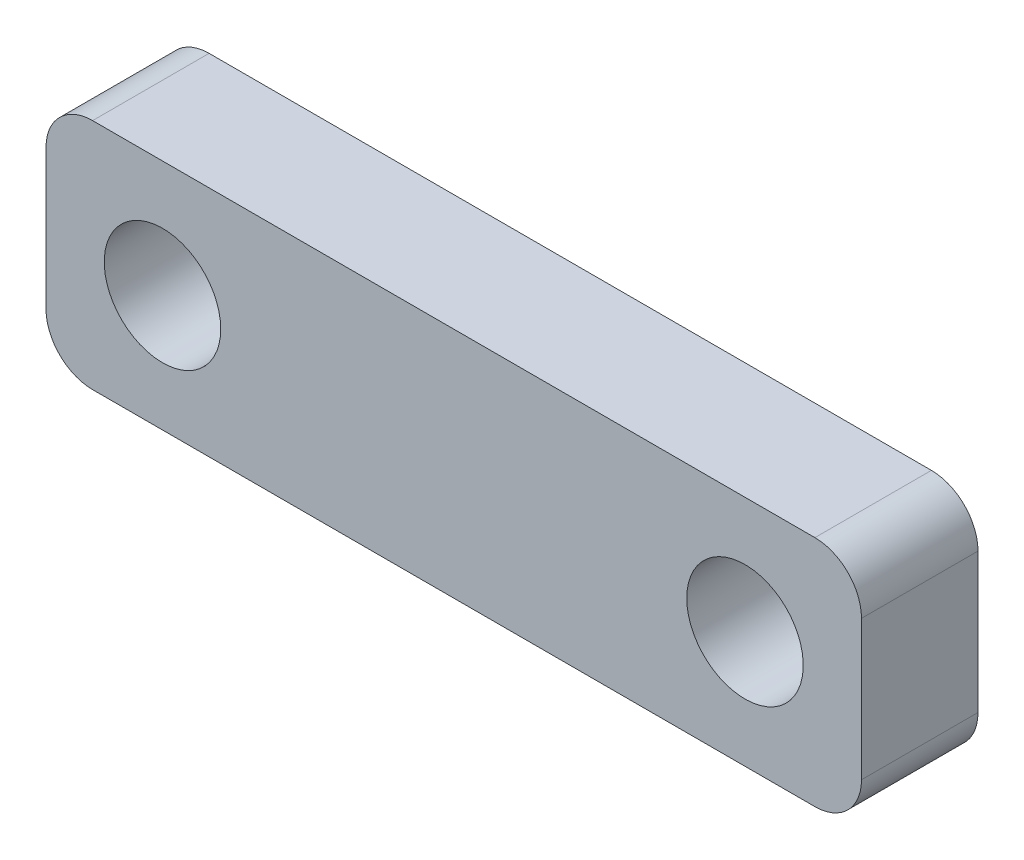
ISO-10303-21;
HEADER;
FILE_DESCRIPTION(('STEP AP214'),'2;1');
FILE_NAME('part.step','',(''),(''),'','','');
FILE_SCHEMA(('AUTOMOTIVE_DESIGN { 1 0 10303 214 1 1 1 1 }'));
ENDSEC;
DATA;
#1=APPLICATION_CONTEXT('core data for automotive mechanical design processes');
#2=APPLICATION_PROTOCOL_DEFINITION('international standard','automotive_design',2000,#1);
#3=PRODUCT_CONTEXT('',#1,'mechanical');
#4=PRODUCT('Part','Part','',(#3));
#5=PRODUCT_RELATED_PRODUCT_CATEGORY('part','',(#4));
#6=PRODUCT_DEFINITION_FORMATION('','',#4);
#7=PRODUCT_DEFINITION_CONTEXT('part definition',#1,'design');
#8=PRODUCT_DEFINITION('design','',#6,#7);
#9=PRODUCT_DEFINITION_SHAPE('','',#8);
#10=(LENGTH_UNIT() NAMED_UNIT(*) SI_UNIT(.MILLI.,.METRE.));
#11=(NAMED_UNIT(*) PLANE_ANGLE_UNIT() SI_UNIT($,.RADIAN.));
#12=(NAMED_UNIT(*) SI_UNIT($,.STERADIAN.) SOLID_ANGLE_UNIT());
#13=UNCERTAINTY_MEASURE_WITH_UNIT(LENGTH_MEASURE(1.E-05),#10,'distance_accuracy_value','');
#14=(GEOMETRIC_REPRESENTATION_CONTEXT(3) GLOBAL_UNCERTAINTY_ASSIGNED_CONTEXT((#13)) GLOBAL_UNIT_ASSIGNED_CONTEXT((#10,
#11,#12)) REPRESENTATION_CONTEXT('',''));
#15=CARTESIAN_POINT('',(0.,0.,0.));
#16=DIRECTION('',(0.,0.,1.));
#17=DIRECTION('',(1.,0.,0.));
#18=AXIS2_PLACEMENT_3D('',#15,#16,#17);
#19=CARTESIAN_POINT('',(0.,0.,5.));
#20=DIRECTION('',(0.,0.,1.));
#21=DIRECTION('',(1.,0.,0.));
#22=AXIS2_PLACEMENT_3D('',#19,#20,#21);
#23=PLANE('',#22);
#24=CARTESIAN_POINT('',(-11.3415861513688,3.36956521739131,5.));
#25=DIRECTION('',(0.,0.,1.));
#26=DIRECTION('',(1.,0.,0.));
#27=AXIS2_PLACEMENT_3D('',#24,#25,#26);
#28=CIRCLE('',#27,2.5);
#29=CARTESIAN_POINT('',(-8.84158615136876,3.36956521739131,5.));
#30=VERTEX_POINT('',#29);
#31=EDGE_CURVE('E126',#30,#30,#28,.T.);
#32=ORIENTED_EDGE('',*,*,#31,.F.);
#33=EDGE_LOOP('',(#32));
#34=FACE_BOUND('',#33,.T.);
#35=DIRECTION('',(1.,0.,0.));
#36=VECTOR('',#35,1.);
#37=CARTESIAN_POINT('',(-16.3415861513688,-1.63043478260869,5.));
#38=LINE('',#37,#36);
#39=CARTESIAN_POINT('',(-14.3415861513688,-1.63043478260869,5.));
#40=VERTEX_POINT('',#39);
#41=CARTESIAN_POINT('',(16.6584138486312,-1.63043478260869,5.));
#42=VERTEX_POINT('',#41);
#43=EDGE_CURVE('E181',#40,#42,#38,.T.);
#44=ORIENTED_EDGE('',*,*,#43,.T.);
#45=CARTESIAN_POINT('',(16.6584138486312,0.369565217391312,5.));
#46=DIRECTION('',(0.,0.,1.));
#47=DIRECTION('',(1.,0.,0.));
#48=AXIS2_PLACEMENT_3D('',#45,#46,#47);
#49=CIRCLE('',#48,2.);
#50=CARTESIAN_POINT('',(18.6584138486312,0.369565217391312,5.));
#51=VERTEX_POINT('',#50);
#52=EDGE_CURVE('E11',#42,#51,#49,.T.);
#53=ORIENTED_EDGE('',*,*,#52,.T.);
#54=DIRECTION('',(0.,1.,0.));
#55=VECTOR('',#54,1.);
#56=CARTESIAN_POINT('',(18.6584138486312,8.36956521739131,5.));
#57=LINE('',#56,#55);
#58=CARTESIAN_POINT('',(18.6584138486312,6.36956521739131,5.));
#59=VERTEX_POINT('',#58);
#60=EDGE_CURVE('E168',#51,#59,#57,.T.);
#61=ORIENTED_EDGE('',*,*,#60,.T.);
#62=CARTESIAN_POINT('',(16.6584138486312,6.36956521739131,5.));
#63=DIRECTION('',(0.,0.,1.));
#64=DIRECTION('',(1.,0.,0.));
#65=AXIS2_PLACEMENT_3D('',#62,#63,#64);
#66=CIRCLE('',#65,2.);
#67=CARTESIAN_POINT('',(16.6584138486312,8.36956521739131,5.));
#68=VERTEX_POINT('',#67);
#69=EDGE_CURVE('E159',#59,#68,#66,.T.);
#70=ORIENTED_EDGE('',*,*,#69,.T.);
#71=DIRECTION('',(-1.,0.,0.));
#72=VECTOR('',#71,1.);
#73=CARTESIAN_POINT('',(-16.3415861513688,8.36956521739131,5.));
#74=LINE('',#73,#72);
#75=CARTESIAN_POINT('',(-14.3415861513688,8.36956521739131,5.));
#76=VERTEX_POINT('',#75);
#77=EDGE_CURVE('E120',#68,#76,#74,.T.);
#78=ORIENTED_EDGE('',*,*,#77,.T.);
#79=CARTESIAN_POINT('',(-14.3415861513688,6.36956521739131,5.));
#80=DIRECTION('',(0.,0.,1.));
#81=DIRECTION('',(1.,0.,0.));
#82=AXIS2_PLACEMENT_3D('',#79,#80,#81);
#83=CIRCLE('',#82,2.);
#84=CARTESIAN_POINT('',(-16.3415861513688,6.36956521739131,5.));
#85=VERTEX_POINT('',#84);
#86=EDGE_CURVE('E140',#76,#85,#83,.T.);
#87=ORIENTED_EDGE('',*,*,#86,.T.);
#88=DIRECTION('',(0.,-1.,0.));
#89=VECTOR('',#88,1.);
#90=CARTESIAN_POINT('',(-16.3415861513688,8.36956521739131,5.));
#91=LINE('',#90,#89);
#92=CARTESIAN_POINT('',(-16.3415861513688,0.369565217391312,5.));
#93=VERTEX_POINT('',#92);
#94=EDGE_CURVE('E119',#85,#93,#91,.T.);
#95=ORIENTED_EDGE('',*,*,#94,.T.);
#96=CARTESIAN_POINT('',(-14.3415861513688,0.369565217391312,5.));
#97=DIRECTION('',(0.,0.,1.));
#98=DIRECTION('',(1.,0.,0.));
#99=AXIS2_PLACEMENT_3D('',#96,#97,#98);
#100=CIRCLE('',#99,2.);
#101=EDGE_CURVE('E148',#93,#40,#100,.T.);
#102=ORIENTED_EDGE('',*,*,#101,.T.);
#103=EDGE_LOOP('',(#44,#53,#61,#70,#78,#87,#95,#102));
#104=FACE_BOUND('',#103,.T.);
#105=CARTESIAN_POINT('',(13.6584138486312,3.36956521739132,5.));
#106=DIRECTION('',(0.,0.,1.));
#107=DIRECTION('',(-1.,0.,0.));
#108=AXIS2_PLACEMENT_3D('',#105,#106,#107);
#109=CIRCLE('',#108,2.5);
#110=CARTESIAN_POINT('',(11.1584138486312,3.36956521739132,5.));
#111=VERTEX_POINT('',#110);
#112=EDGE_CURVE('E186',#111,#111,#109,.T.);
#113=ORIENTED_EDGE('',*,*,#112,.F.);
#114=EDGE_LOOP('',(#113));
#115=FACE_BOUND('',#114,.T.);
#116=ADVANCED_FACE('F36',(#34,#104,#115),#23,.T.);
#117=CARTESIAN_POINT('',(0.,0.,0.));
#118=DIRECTION('',(0.,0.,1.));
#119=DIRECTION('',(1.,0.,0.));
#120=AXIS2_PLACEMENT_3D('',#117,#118,#119);
#121=PLANE('',#120);
#122=DIRECTION('',(0.,1.,0.));
#123=VECTOR('',#122,1.);
#124=CARTESIAN_POINT('',(18.6584138486312,8.36956521739131,0.));
#125=LINE('',#124,#123);
#126=CARTESIAN_POINT('',(18.6584138486312,0.369565217391312,0.));
#127=VERTEX_POINT('',#126);
#128=CARTESIAN_POINT('',(18.6584138486312,6.36956521739131,0.));
#129=VERTEX_POINT('',#128);
#130=EDGE_CURVE('E128',#127,#129,#125,.T.);
#131=ORIENTED_EDGE('',*,*,#130,.F.);
#132=CARTESIAN_POINT('',(16.6584138486312,0.369565217391312,0.));
#133=DIRECTION('',(0.,0.,1.));
#134=DIRECTION('',(1.,0.,0.));
#135=AXIS2_PLACEMENT_3D('',#132,#133,#134);
#136=CIRCLE('',#135,2.);
#137=CARTESIAN_POINT('',(16.6584138486312,-1.63043478260869,0.));
#138=VERTEX_POINT('',#137);
#139=EDGE_CURVE('E58',#127,#138,#136,.F.);
#140=ORIENTED_EDGE('',*,*,#139,.T.);
#141=DIRECTION('',(1.,0.,0.));
#142=VECTOR('',#141,1.);
#143=CARTESIAN_POINT('',(-16.3415861513688,-1.63043478260869,0.));
#144=LINE('',#143,#142);
#145=CARTESIAN_POINT('',(-14.3415861513688,-1.63043478260869,0.));
#146=VERTEX_POINT('',#145);
#147=EDGE_CURVE('E125',#146,#138,#144,.T.);
#148=ORIENTED_EDGE('',*,*,#147,.F.);
#149=CARTESIAN_POINT('',(-14.3415861513688,0.369565217391312,0.));
#150=DIRECTION('',(0.,0.,1.));
#151=DIRECTION('',(1.,0.,0.));
#152=AXIS2_PLACEMENT_3D('',#149,#150,#151);
#153=CIRCLE('',#152,2.);
#154=CARTESIAN_POINT('',(-16.3415861513688,0.369565217391312,0.));
#155=VERTEX_POINT('',#154);
#156=EDGE_CURVE('E124',#146,#155,#153,.F.);
#157=ORIENTED_EDGE('',*,*,#156,.T.);
#158=DIRECTION('',(0.,-1.,0.));
#159=VECTOR('',#158,1.);
#160=CARTESIAN_POINT('',(-16.3415861513688,8.36956521739131,0.));
#161=LINE('',#160,#159);
#162=CARTESIAN_POINT('',(-16.3415861513688,6.36956521739131,0.));
#163=VERTEX_POINT('',#162);
#164=EDGE_CURVE('E116',#163,#155,#161,.T.);
#165=ORIENTED_EDGE('',*,*,#164,.F.);
#166=CARTESIAN_POINT('',(-14.3415861513688,6.36956521739131,0.));
#167=DIRECTION('',(0.,0.,1.));
#168=DIRECTION('',(1.,0.,0.));
#169=AXIS2_PLACEMENT_3D('',#166,#167,#168);
#170=CIRCLE('',#169,2.);
#171=CARTESIAN_POINT('',(-14.3415861513688,8.36956521739131,0.));
#172=VERTEX_POINT('',#171);
#173=EDGE_CURVE('E102',#163,#172,#170,.F.);
#174=ORIENTED_EDGE('',*,*,#173,.T.);
#175=DIRECTION('',(-1.,0.,0.));
#176=VECTOR('',#175,1.);
#177=CARTESIAN_POINT('',(-16.3415861513688,8.36956521739131,0.));
#178=LINE('',#177,#176);
#179=CARTESIAN_POINT('',(16.6584138486312,8.36956521739131,0.));
#180=VERTEX_POINT('',#179);
#181=EDGE_CURVE('E137',#180,#172,#178,.T.);
#182=ORIENTED_EDGE('',*,*,#181,.F.);
#183=CARTESIAN_POINT('',(16.6584138486312,6.36956521739131,0.));
#184=DIRECTION('',(0.,0.,1.));
#185=DIRECTION('',(1.,0.,0.));
#186=AXIS2_PLACEMENT_3D('',#183,#184,#185);
#187=CIRCLE('',#186,2.);
#188=EDGE_CURVE('E153',#180,#129,#187,.F.);
#189=ORIENTED_EDGE('',*,*,#188,.T.);
#190=EDGE_LOOP('',(#131,#140,#148,#157,#165,#174,#182,#189));
#191=FACE_BOUND('',#190,.T.);
#192=CARTESIAN_POINT('',(-11.3415861513688,3.36956521739131,0.));
#193=DIRECTION('',(0.,0.,1.));
#194=DIRECTION('',(1.,0.,0.));
#195=AXIS2_PLACEMENT_3D('',#192,#193,#194);
#196=CIRCLE('',#195,2.5);
#197=CARTESIAN_POINT('',(-8.84158615136876,3.36956521739131,0.));
#198=VERTEX_POINT('',#197);
#199=EDGE_CURVE('E131',#198,#198,#196,.T.);
#200=ORIENTED_EDGE('',*,*,#199,.T.);
#201=EDGE_LOOP('',(#200));
#202=FACE_BOUND('',#201,.T.);
#203=CARTESIAN_POINT('',(13.6584138486312,3.36956521739132,0.));
#204=DIRECTION('',(0.,0.,1.));
#205=DIRECTION('',(-1.,0.,0.));
#206=AXIS2_PLACEMENT_3D('',#203,#204,#205);
#207=CIRCLE('',#206,2.5);
#208=CARTESIAN_POINT('',(11.1584138486312,3.36956521739132,0.));
#209=VERTEX_POINT('',#208);
#210=EDGE_CURVE('E188',#209,#209,#207,.T.);
#211=ORIENTED_EDGE('',*,*,#210,.T.);
#212=EDGE_LOOP('',(#211));
#213=FACE_BOUND('',#212,.T.);
#214=ADVANCED_FACE('F122',(#191,#202,#213),#121,.F.);
#215=CARTESIAN_POINT('',(-16.3415861513688,8.36956521739131,5.));
#216=DIRECTION('',(1.,0.,0.));
#217=DIRECTION('',(0.,1.,0.));
#218=AXIS2_PLACEMENT_3D('',#215,#216,#217);
#219=PLANE('',#218);
#220=ORIENTED_EDGE('',*,*,#164,.T.);
#221=DIRECTION('',(0.,0.,-1.));
#222=VECTOR('',#221,1.);
#223=CARTESIAN_POINT('',(-16.3415861513688,0.369565217391312,5.));
#224=LINE('',#223,#222);
#225=EDGE_CURVE('E146',#155,#93,#224,.F.);
#226=ORIENTED_EDGE('',*,*,#225,.T.);
#227=ORIENTED_EDGE('',*,*,#94,.F.);
#228=DIRECTION('',(0.,0.,-1.));
#229=VECTOR('',#228,1.);
#230=CARTESIAN_POINT('',(-16.3415861513688,6.36956521739131,5.));
#231=LINE('',#230,#229);
#232=EDGE_CURVE('E106',#85,#163,#231,.T.);
#233=ORIENTED_EDGE('',*,*,#232,.T.);
#234=EDGE_LOOP('',(#220,#226,#227,#233));
#235=FACE_BOUND('',#234,.T.);
#236=ADVANCED_FACE('F115',(#235),#219,.F.);
#237=CARTESIAN_POINT('',(-16.3415861513688,-1.63043478260869,5.));
#238=DIRECTION('',(0.,1.,0.));
#239=DIRECTION('',(0.,0.,1.));
#240=AXIS2_PLACEMENT_3D('',#237,#238,#239);
#241=PLANE('',#240);
#242=ORIENTED_EDGE('',*,*,#147,.T.);
#243=DIRECTION('',(0.,0.,-1.));
#244=VECTOR('',#243,1.);
#245=CARTESIAN_POINT('',(16.6584138486312,-1.63043478260869,5.));
#246=LINE('',#245,#244);
#247=EDGE_CURVE('E44',#138,#42,#246,.F.);
#248=ORIENTED_EDGE('',*,*,#247,.T.);
#249=ORIENTED_EDGE('',*,*,#43,.F.);
#250=DIRECTION('',(0.,0.,-1.));
#251=VECTOR('',#250,1.);
#252=CARTESIAN_POINT('',(-14.3415861513688,-1.63043478260869,5.));
#253=LINE('',#252,#251);
#254=EDGE_CURVE('E142',#40,#146,#253,.T.);
#255=ORIENTED_EDGE('',*,*,#254,.T.);
#256=EDGE_LOOP('',(#242,#248,#249,#255));
#257=FACE_BOUND('',#256,.T.);
#258=ADVANCED_FACE('F212',(#257),#241,.F.);
#259=CARTESIAN_POINT('',(18.6584138486312,8.36956521739131,5.));
#260=DIRECTION('',(-1.,0.,0.));
#261=DIRECTION('',(0.,0.,1.));
#262=AXIS2_PLACEMENT_3D('',#259,#260,#261);
#263=PLANE('',#262);
#264=ORIENTED_EDGE('',*,*,#60,.F.);
#265=DIRECTION('',(0.,0.,-1.));
#266=VECTOR('',#265,1.);
#267=CARTESIAN_POINT('',(18.6584138486312,0.369565217391312,5.));
#268=LINE('',#267,#266);
#269=EDGE_CURVE('E161',#51,#127,#268,.T.);
#270=ORIENTED_EDGE('',*,*,#269,.T.);
#271=ORIENTED_EDGE('',*,*,#130,.T.);
#272=DIRECTION('',(0.,0.,-1.));
#273=VECTOR('',#272,1.);
#274=CARTESIAN_POINT('',(18.6584138486312,6.36956521739131,5.));
#275=LINE('',#274,#273);
#276=EDGE_CURVE('E156',#129,#59,#275,.F.);
#277=ORIENTED_EDGE('',*,*,#276,.T.);
#278=EDGE_LOOP('',(#264,#270,#271,#277));
#279=FACE_BOUND('',#278,.T.);
#280=ADVANCED_FACE('F167',(#279),#263,.F.);
#281=CARTESIAN_POINT('',(-16.3415861513688,8.36956521739131,5.));
#282=DIRECTION('',(0.,-1.,0.));
#283=DIRECTION('',(0.,0.,-1.));
#284=AXIS2_PLACEMENT_3D('',#281,#282,#283);
#285=PLANE('',#284);
#286=ORIENTED_EDGE('',*,*,#77,.F.);
#287=DIRECTION('',(0.,0.,-1.));
#288=VECTOR('',#287,1.);
#289=CARTESIAN_POINT('',(16.6584138486312,8.36956521739131,5.));
#290=LINE('',#289,#288);
#291=EDGE_CURVE('E150',#68,#180,#290,.T.);
#292=ORIENTED_EDGE('',*,*,#291,.T.);
#293=ORIENTED_EDGE('',*,*,#181,.T.);
#294=DIRECTION('',(0.,0.,-1.));
#295=VECTOR('',#294,1.);
#296=CARTESIAN_POINT('',(-14.3415861513688,8.36956521739131,5.));
#297=LINE('',#296,#295);
#298=EDGE_CURVE('E108',#172,#76,#297,.F.);
#299=ORIENTED_EDGE('',*,*,#298,.T.);
#300=EDGE_LOOP('',(#286,#292,#293,#299));
#301=FACE_BOUND('',#300,.T.);
#302=ADVANCED_FACE('F180',(#301),#285,.F.);
#303=CARTESIAN_POINT('',(-11.3415861513688,3.36956521739131,5.));
#304=DIRECTION('',(0.,0.,-1.));
#305=DIRECTION('',(-1.,0.,0.));
#306=AXIS2_PLACEMENT_3D('',#303,#304,#305);
#307=CYLINDRICAL_SURFACE('',#306,2.5);
#308=ORIENTED_EDGE('',*,*,#31,.T.);
#309=EDGE_LOOP('',(#308));
#310=FACE_BOUND('',#309,.T.);
#311=ORIENTED_EDGE('',*,*,#199,.F.);
#312=EDGE_LOOP('',(#311));
#313=FACE_BOUND('',#312,.T.);
#314=ADVANCED_FACE('F205',(#310,#313),#307,.F.);
#315=CARTESIAN_POINT('',(13.6584138486312,3.36956521739132,5.));
#316=DIRECTION('',(0.,0.,-1.));
#317=DIRECTION('',(-1.,0.,0.));
#318=AXIS2_PLACEMENT_3D('',#315,#316,#317);
#319=CYLINDRICAL_SURFACE('',#318,2.5);
#320=ORIENTED_EDGE('',*,*,#112,.T.);
#321=EDGE_LOOP('',(#320));
#322=FACE_BOUND('',#321,.T.);
#323=ORIENTED_EDGE('',*,*,#210,.F.);
#324=EDGE_LOOP('',(#323));
#325=FACE_BOUND('',#324,.T.);
#326=ADVANCED_FACE('F194',(#322,#325),#319,.F.);
#327=CARTESIAN_POINT('',(-14.3415861513688,6.36956521739131,5.));
#328=DIRECTION('',(0.,0.,-1.));
#329=DIRECTION('',(-1.,0.,0.));
#330=AXIS2_PLACEMENT_3D('',#327,#328,#329);
#331=CYLINDRICAL_SURFACE('',#330,2.);
#332=ORIENTED_EDGE('',*,*,#86,.F.);
#333=ORIENTED_EDGE('',*,*,#298,.F.);
#334=ORIENTED_EDGE('',*,*,#173,.F.);
#335=ORIENTED_EDGE('',*,*,#232,.F.);
#336=EDGE_LOOP('',(#332,#333,#334,#335));
#337=FACE_BOUND('',#336,.T.);
#338=ADVANCED_FACE('F105',(#337),#331,.T.);
#339=CARTESIAN_POINT('',(-14.3415861513688,0.369565217391312,5.));
#340=DIRECTION('',(0.,0.,-1.));
#341=DIRECTION('',(-1.,0.,0.));
#342=AXIS2_PLACEMENT_3D('',#339,#340,#341);
#343=CYLINDRICAL_SURFACE('',#342,2.);
#344=ORIENTED_EDGE('',*,*,#101,.F.);
#345=ORIENTED_EDGE('',*,*,#225,.F.);
#346=ORIENTED_EDGE('',*,*,#156,.F.);
#347=ORIENTED_EDGE('',*,*,#254,.F.);
#348=EDGE_LOOP('',(#344,#345,#346,#347));
#349=FACE_BOUND('',#348,.T.);
#350=ADVANCED_FACE('F219',(#349),#343,.T.);
#351=CARTESIAN_POINT('',(16.6584138486312,6.36956521739131,5.));
#352=DIRECTION('',(0.,0.,-1.));
#353=DIRECTION('',(-1.,0.,0.));
#354=AXIS2_PLACEMENT_3D('',#351,#352,#353);
#355=CYLINDRICAL_SURFACE('',#354,2.);
#356=ORIENTED_EDGE('',*,*,#69,.F.);
#357=ORIENTED_EDGE('',*,*,#276,.F.);
#358=ORIENTED_EDGE('',*,*,#188,.F.);
#359=ORIENTED_EDGE('',*,*,#291,.F.);
#360=EDGE_LOOP('',(#356,#357,#358,#359));
#361=FACE_BOUND('',#360,.T.);
#362=ADVANCED_FACE('F175',(#361),#355,.T.);
#363=CARTESIAN_POINT('',(16.6584138486312,0.369565217391312,5.));
#364=DIRECTION('',(0.,0.,-1.));
#365=DIRECTION('',(-1.,0.,0.));
#366=AXIS2_PLACEMENT_3D('',#363,#364,#365);
#367=CYLINDRICAL_SURFACE('',#366,2.);
#368=ORIENTED_EDGE('',*,*,#52,.F.);
#369=ORIENTED_EDGE('',*,*,#247,.F.);
#370=ORIENTED_EDGE('',*,*,#139,.F.);
#371=ORIENTED_EDGE('',*,*,#269,.F.);
#372=EDGE_LOOP('',(#368,#369,#370,#371));
#373=FACE_BOUND('',#372,.T.);
#374=ADVANCED_FACE('F38',(#373),#367,.T.);
#375=CLOSED_SHELL('',(#116,#214,#236,#258,#280,#302,#314,#326,#338,#350,#362,#374));
#376=MANIFOLD_SOLID_BREP('B2',#375);
#377=ADVANCED_BREP_SHAPE_REPRESENTATION('',(#18,#376),#14);
#378=SHAPE_DEFINITION_REPRESENTATION(#9,#377);
ENDSEC;
END-ISO-10303-21;
